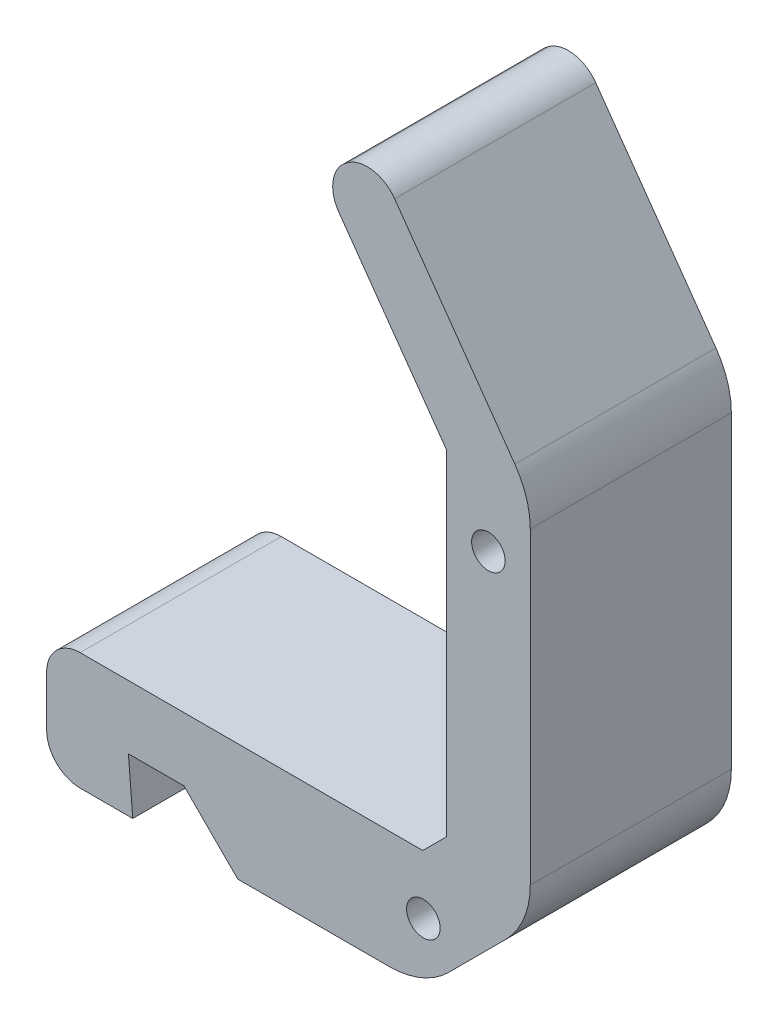
ISO-10303-21;
HEADER;
FILE_DESCRIPTION(('STEP AP214'),'2;1');
FILE_NAME('part.step','',(''),(''),'','','');
FILE_SCHEMA(('AUTOMOTIVE_DESIGN { 1 0 10303 214 1 1 1 1 }'));
ENDSEC;
DATA;
#1=APPLICATION_CONTEXT('core data for automotive mechanical design processes');
#2=APPLICATION_PROTOCOL_DEFINITION('international standard','automotive_design',2000,#1);
#3=PRODUCT_CONTEXT('',#1,'mechanical');
#4=PRODUCT('Part','Part','',(#3));
#5=PRODUCT_RELATED_PRODUCT_CATEGORY('part','',(#4));
#6=PRODUCT_DEFINITION_FORMATION('','',#4);
#7=PRODUCT_DEFINITION_CONTEXT('part definition',#1,'design');
#8=PRODUCT_DEFINITION('design','',#6,#7);
#9=PRODUCT_DEFINITION_SHAPE('','',#8);
#10=(LENGTH_UNIT() NAMED_UNIT(*) SI_UNIT(.MILLI.,.METRE.));
#11=(NAMED_UNIT(*) PLANE_ANGLE_UNIT() SI_UNIT($,.RADIAN.));
#12=(NAMED_UNIT(*) SI_UNIT($,.STERADIAN.) SOLID_ANGLE_UNIT());
#13=UNCERTAINTY_MEASURE_WITH_UNIT(LENGTH_MEASURE(1.E-05),#10,'distance_accuracy_value','');
#14=(GEOMETRIC_REPRESENTATION_CONTEXT(3) GLOBAL_UNCERTAINTY_ASSIGNED_CONTEXT((#13)) GLOBAL_UNIT_ASSIGNED_CONTEXT((#10,
#11,#12)) REPRESENTATION_CONTEXT('',''));
#15=CARTESIAN_POINT('',(0.,0.,0.));
#16=DIRECTION('',(0.,0.,1.));
#17=DIRECTION('',(1.,0.,0.));
#18=AXIS2_PLACEMENT_3D('',#15,#16,#17);
#19=CARTESIAN_POINT('',(0.,0.,15.24));
#20=DIRECTION('',(0.,0.,1.));
#21=DIRECTION('',(1.,0.,0.));
#22=AXIS2_PLACEMENT_3D('',#19,#20,#21);
#23=PLANE('',#22);
#24=CARTESIAN_POINT('',(-0.0451280605345879,4.445,15.24));
#25=DIRECTION('',(0.,0.,1.));
#26=DIRECTION('',(1.,0.,0.));
#27=AXIS2_PLACEMENT_3D('',#24,#25,#26);
#28=CIRCLE('',#27,1.27);
#29=CARTESIAN_POINT('',(-1.31512806053459,4.445,15.24));
#30=VERTEX_POINT('',#29);
#31=EDGE_CURVE('E255',#30,#30,#28,.T.);
#32=ORIENTED_EDGE('',*,*,#31,.F.);
#33=EDGE_LOOP('',(#32));
#34=FACE_BOUND('',#33,.T.);
#35=DIRECTION('',(-0.578165069509396,0.815919819834765,0.));
#36=VECTOR('',#35,1.);
#37=CARTESIAN_POINT('',(-3.69251910928628,52.6655419632563,15.24));
#38=LINE('',#37,#36);
#39=CARTESIAN_POINT('',(6.88688595909541,37.7356426445761,15.24));
#40=VERTEX_POINT('',#39);
#41=CARTESIAN_POINT('',(-2.22397983273241,50.593105620876,15.24));
#42=VERTEX_POINT('',#41);
#43=EDGE_CURVE('E463',#40,#42,#38,.T.);
#44=ORIENTED_EDGE('',*,*,#43,.T.);
#45=CARTESIAN_POINT('',(-4.29641617511272,49.1245663443221,15.24));
#46=DIRECTION('',(0.,0.,1.));
#47=DIRECTION('',(1.,0.,0.));
#48=AXIS2_PLACEMENT_3D('',#45,#46,#47);
#49=CIRCLE('',#48,2.54);
#50=CARTESIAN_POINT('',(-5.76495545166658,51.1970026867024,15.24));
#51=VERTEX_POINT('',#50);
#52=EDGE_CURVE('E387',#42,#51,#49,.T.);
#53=ORIENTED_EDGE('',*,*,#52,.T.);
#54=DIRECTION('',(-0.815919819834766,-0.578165069509395,0.));
#55=VECTOR('',#54,1.);
#56=CARTESIAN_POINT('',(-7.91987382702117,49.670016208391,15.24));
#57=LINE('',#56,#55);
#58=CARTESIAN_POINT('',(-5.84743748464086,51.1385554849449,15.24));
#59=VERTEX_POINT('',#58);
#60=EDGE_CURVE('E203',#51,#59,#57,.T.);
#61=ORIENTED_EDGE('',*,*,#60,.T.);
#62=CARTESIAN_POINT('',(-4.378898208087,49.0661191425646,15.24));
#63=DIRECTION('',(0.,0.,1.));
#64=DIRECTION('',(1.,0.,0.));
#65=AXIS2_PLACEMENT_3D('',#62,#63,#64);
#66=CIRCLE('',#65,2.54);
#67=CARTESIAN_POINT('',(-6.4513345504673,47.5975798660107,15.24));
#68=VERTEX_POINT('',#67);
#69=EDGE_CURVE('E198',#59,#68,#66,.T.);
#70=ORIENTED_EDGE('',*,*,#69,.T.);
#71=DIRECTION('',(0.578165069509396,-0.815919819834765,0.));
#72=VECTOR('',#71,1.);
#73=CARTESIAN_POINT('',(1.70579510314465,36.0860512242138,15.24));
#74=LINE('',#73,#72);
#75=CARTESIAN_POINT('',(1.70579510314465,36.0860512242138,15.24));
#76=VERTEX_POINT('',#75);
#77=EDGE_CURVE('E189',#68,#76,#74,.T.);
#78=ORIENTED_EDGE('',*,*,#77,.T.);
#79=DIRECTION('',(0.,-1.,0.));
#80=VECTOR('',#79,1.);
#81=CARTESIAN_POINT('',(1.70579510314465,36.0860512242138,15.24));
#82=LINE('',#81,#80);
#83=CARTESIAN_POINT('',(1.70579510314466,10.6860512242138,15.24));
#84=VERTEX_POINT('',#83);
#85=EDGE_CURVE('E194',#76,#84,#82,.T.);
#86=ORIENTED_EDGE('',*,*,#85,.T.);
#87=DIRECTION('',(-0.707106781186547,-0.707106781186548,0.));
#88=VECTOR('',#87,1.);
#89=CARTESIAN_POINT('',(1.70579510314466,10.6860512242138,15.24));
#90=LINE('',#89,#88);
#91=CARTESIAN_POINT('',(-0.0902561210691757,8.89,15.24));
#92=VERTEX_POINT('',#91);
#93=EDGE_CURVE('E220',#84,#92,#90,.T.);
#94=ORIENTED_EDGE('',*,*,#93,.T.);
#95=DIRECTION('',(-1.,0.,0.));
#96=VECTOR('',#95,1.);
#97=CARTESIAN_POINT('',(-0.0902561210691757,8.89,15.24));
#98=LINE('',#97,#96);
#99=CARTESIAN_POINT('',(-26.0556304028333,8.89,15.24));
#100=VERTEX_POINT('',#99);
#101=EDGE_CURVE('E223',#92,#100,#98,.T.);
#102=ORIENTED_EDGE('',*,*,#101,.T.);
#103=CARTESIAN_POINT('',(-26.0556304028333,6.35,15.24));
#104=DIRECTION('',(0.,0.,1.));
#105=DIRECTION('',(1.,0.,0.));
#106=AXIS2_PLACEMENT_3D('',#103,#104,#105);
#107=CIRCLE('',#106,2.54);
#108=CARTESIAN_POINT('',(-28.5956304028333,6.35,15.24));
#109=VERTEX_POINT('',#108);
#110=EDGE_CURVE('E382',#100,#109,#107,.T.);
#111=ORIENTED_EDGE('',*,*,#110,.T.);
#112=DIRECTION('',(0.,-1.,0.));
#113=VECTOR('',#112,1.);
#114=CARTESIAN_POINT('',(-28.5956304028333,0.,15.24));
#115=LINE('',#114,#113);
#116=CARTESIAN_POINT('',(-28.5956304028333,2.54,15.24));
#117=VERTEX_POINT('',#116);
#118=EDGE_CURVE('E230',#109,#117,#115,.T.);
#119=ORIENTED_EDGE('',*,*,#118,.T.);
#120=CARTESIAN_POINT('',(-26.0556304028333,2.54,15.24));
#121=DIRECTION('',(0.,0.,1.));
#122=DIRECTION('',(1.,0.,0.));
#123=AXIS2_PLACEMENT_3D('',#120,#121,#122);
#124=CIRCLE('',#123,2.54);
#125=CARTESIAN_POINT('',(-26.0556304028333,0.,15.24));
#126=VERTEX_POINT('',#125);
#127=EDGE_CURVE('E61',#117,#126,#124,.T.);
#128=ORIENTED_EDGE('',*,*,#127,.T.);
#129=DIRECTION('',(1.,0.,0.));
#130=VECTOR('',#129,1.);
#131=CARTESIAN_POINT('',(-22.0682023149362,0.,15.24));
#132=LINE('',#131,#130);
#133=CARTESIAN_POINT('',(-22.0682023149362,0.,15.24));
#134=VERTEX_POINT('',#133);
#135=EDGE_CURVE('E233',#126,#134,#132,.T.);
#136=ORIENTED_EDGE('',*,*,#135,.T.);
#137=DIRECTION('',(-0.0807809246104137,0.996731880808017,0.));
#138=VECTOR('',#137,1.);
#139=CARTESIAN_POINT('',(-22.3990657727126,4.08242611916741,15.24));
#140=LINE('',#139,#138);
#141=CARTESIAN_POINT('',(-22.3990657727126,4.08242611916741,15.24));
#142=VERTEX_POINT('',#141);
#143=EDGE_CURVE('E236',#134,#142,#140,.T.);
#144=ORIENTED_EDGE('',*,*,#143,.T.);
#145=DIRECTION('',(1.,0.,0.));
#146=VECTOR('',#145,1.);
#147=CARTESIAN_POINT('',(-18.1907700285421,4.08242611916741,15.24));
#148=LINE('',#147,#146);
#149=CARTESIAN_POINT('',(-18.1907700285421,4.08242611916741,15.24));
#150=VERTEX_POINT('',#149);
#151=EDGE_CURVE('E239',#142,#150,#148,.T.);
#152=ORIENTED_EDGE('',*,*,#151,.T.);
#153=DIRECTION('',(0.707106781186546,-0.707106781186549,0.));
#154=VECTOR('',#153,1.);
#155=CARTESIAN_POINT('',(-14.1083439093747,0.,15.24));
#156=LINE('',#155,#154);
#157=CARTESIAN_POINT('',(-14.1083439093747,0.,15.24));
#158=VERTEX_POINT('',#157);
#159=EDGE_CURVE('E242',#150,#158,#156,.T.);
#160=ORIENTED_EDGE('',*,*,#159,.T.);
#161=DIRECTION('',(1.,0.,0.));
#162=VECTOR('',#161,1.);
#163=CARTESIAN_POINT('',(0.,0.,15.24));
#164=LINE('',#163,#162);
#165=CARTESIAN_POINT('',(-2.63025612106916,0.,15.24));
#166=VERTEX_POINT('',#165);
#167=EDGE_CURVE('E245',#158,#166,#164,.T.);
#168=ORIENTED_EDGE('',*,*,#167,.T.);
#169=CARTESIAN_POINT('',(-2.63025612106916,6.35,15.24));
#170=DIRECTION('',(0.,0.,1.));
#171=DIRECTION('',(1.,0.,0.));
#172=AXIS2_PLACEMENT_3D('',#169,#170,#171);
#173=CIRCLE('',#172,6.35);
#174=CARTESIAN_POINT('',(1.85987193946542,1.85987193946543,15.24));
#175=VERTEX_POINT('',#174);
#176=EDGE_CURVE('E339',#166,#175,#173,.T.);
#177=ORIENTED_EDGE('',*,*,#176,.T.);
#178=DIRECTION('',(0.707106781186546,0.707106781186549,0.));
#179=VECTOR('',#178,1.);
#180=CARTESIAN_POINT('',(0.,0.,15.24));
#181=LINE('',#180,#179);
#182=CARTESIAN_POINT('',(6.19592316367923,6.19592316367925,15.24));
#183=VERTEX_POINT('',#182);
#184=EDGE_CURVE('E298',#175,#183,#181,.T.);
#185=ORIENTED_EDGE('',*,*,#184,.T.);
#186=CARTESIAN_POINT('',(1.70579510314465,10.6860512242138,15.24));
#187=DIRECTION('',(0.,0.,1.));
#188=DIRECTION('',(1.,0.,0.));
#189=AXIS2_PLACEMENT_3D('',#186,#187,#188);
#190=CIRCLE('',#189,6.35);
#191=CARTESIAN_POINT('',(8.05579510314465,10.6860512242138,15.24));
#192=VERTEX_POINT('',#191);
#193=EDGE_CURVE('E342',#183,#192,#190,.T.);
#194=ORIENTED_EDGE('',*,*,#193,.T.);
#195=DIRECTION('',(0.,1.,0.));
#196=VECTOR('',#195,1.);
#197=CARTESIAN_POINT('',(8.05579510314465,8.05579510314468,15.24));
#198=LINE('',#197,#196);
#199=CARTESIAN_POINT('',(8.05579510314465,34.0642944531915,15.24));
#200=VERTEX_POINT('',#199);
#201=EDGE_CURVE('E460',#192,#200,#198,.T.);
#202=ORIENTED_EDGE('',*,*,#201,.T.);
#203=CARTESIAN_POINT('',(1.70579510314465,34.0642944531915,15.24));
#204=DIRECTION('',(0.,0.,1.));
#205=DIRECTION('',(1.,0.,0.));
#206=AXIS2_PLACEMENT_3D('',#203,#204,#205);
#207=CIRCLE('',#206,6.35);
#208=EDGE_CURVE('E345',#200,#40,#207,.T.);
#209=ORIENTED_EDGE('',*,*,#208,.T.);
#210=EDGE_LOOP('',(#44,#53,#61,#70,#78,#86,#94,#102,#111,#119,#128,#136,#144,#152,#160,#168,
#177,#185,#194,#202,#209));
#211=FACE_BOUND('',#210,.T.);
#212=CARTESIAN_POINT('',(4.88079510314465,31.0060512242138,15.24));
#213=DIRECTION('',(0.,0.,1.));
#214=DIRECTION('',(1.,0.,0.));
#215=AXIS2_PLACEMENT_3D('',#212,#213,#214);
#216=CIRCLE('',#215,1.27);
#217=CARTESIAN_POINT('',(3.61079510314465,31.0060512242138,15.24));
#218=VERTEX_POINT('',#217);
#219=EDGE_CURVE('E703',#218,#218,#216,.T.);
#220=ORIENTED_EDGE('',*,*,#219,.F.);
#221=EDGE_LOOP('',(#220));
#222=FACE_BOUND('',#221,.T.);
#223=ADVANCED_FACE('F45',(#34,#211,#222),#23,.T.);
#224=CARTESIAN_POINT('',(0.,0.,0.));
#225=DIRECTION('',(0.,0.,1.));
#226=DIRECTION('',(1.,0.,0.));
#227=AXIS2_PLACEMENT_3D('',#224,#225,#226);
#228=PLANE('',#227);
#229=DIRECTION('',(-0.815919819834766,-0.578165069509395,0.));
#230=VECTOR('',#229,1.);
#231=CARTESIAN_POINT('',(-7.91987382702117,49.670016208391,0.));
#232=LINE('',#231,#230);
#233=CARTESIAN_POINT('',(-5.76495545166658,51.1970026867024,0.));
#234=VERTEX_POINT('',#233);
#235=CARTESIAN_POINT('',(-5.84743748464086,51.1385554849449,0.));
#236=VERTEX_POINT('',#235);
#237=EDGE_CURVE('E263',#234,#236,#232,.T.);
#238=ORIENTED_EDGE('',*,*,#237,.F.);
#239=CARTESIAN_POINT('',(-4.29641617511272,49.1245663443221,0.));
#240=DIRECTION('',(0.,0.,1.));
#241=DIRECTION('',(1.,0.,0.));
#242=AXIS2_PLACEMENT_3D('',#239,#240,#241);
#243=CIRCLE('',#242,2.54);
#244=CARTESIAN_POINT('',(-2.22397983273241,50.593105620876,0.));
#245=VERTEX_POINT('',#244);
#246=EDGE_CURVE('E374',#234,#245,#243,.F.);
#247=ORIENTED_EDGE('',*,*,#246,.T.);
#248=DIRECTION('',(-0.578165069509396,0.815919819834765,0.));
#249=VECTOR('',#248,1.);
#250=CARTESIAN_POINT('',(-3.69251910928628,52.6655419632563,0.));
#251=LINE('',#250,#249);
#252=CARTESIAN_POINT('',(6.88688595909541,37.7356426445761,0.));
#253=VERTEX_POINT('',#252);
#254=EDGE_CURVE('E259',#253,#245,#251,.T.);
#255=ORIENTED_EDGE('',*,*,#254,.F.);
#256=CARTESIAN_POINT('',(1.70579510314465,34.0642944531915,0.));
#257=DIRECTION('',(0.,0.,1.));
#258=DIRECTION('',(1.,0.,0.));
#259=AXIS2_PLACEMENT_3D('',#256,#257,#258);
#260=CIRCLE('',#259,6.35);
#261=CARTESIAN_POINT('',(8.05579510314465,34.0642944531915,0.));
#262=VERTEX_POINT('',#261);
#263=EDGE_CURVE('E329',#253,#262,#260,.F.);
#264=ORIENTED_EDGE('',*,*,#263,.T.);
#265=DIRECTION('',(0.,1.,0.));
#266=VECTOR('',#265,1.);
#267=CARTESIAN_POINT('',(8.05579510314465,8.05579510314468,0.));
#268=LINE('',#267,#266);
#269=CARTESIAN_POINT('',(8.05579510314465,10.6860512242138,0.));
#270=VERTEX_POINT('',#269);
#271=EDGE_CURVE('E254',#270,#262,#268,.T.);
#272=ORIENTED_EDGE('',*,*,#271,.F.);
#273=CARTESIAN_POINT('',(1.70579510314465,10.6860512242138,0.));
#274=DIRECTION('',(0.,0.,1.));
#275=DIRECTION('',(1.,0.,0.));
#276=AXIS2_PLACEMENT_3D('',#273,#274,#275);
#277=CIRCLE('',#276,6.35);
#278=CARTESIAN_POINT('',(6.19592316367923,6.19592316367925,0.));
#279=VERTEX_POINT('',#278);
#280=EDGE_CURVE('E326',#270,#279,#277,.F.);
#281=ORIENTED_EDGE('',*,*,#280,.T.);
#282=DIRECTION('',(0.707106781186546,0.707106781186549,0.));
#283=VECTOR('',#282,1.);
#284=CARTESIAN_POINT('',(0.,0.,0.));
#285=LINE('',#284,#283);
#286=CARTESIAN_POINT('',(1.85987193946542,1.85987193946543,0.));
#287=VERTEX_POINT('',#286);
#288=EDGE_CURVE('E250',#287,#279,#285,.T.);
#289=ORIENTED_EDGE('',*,*,#288,.F.);
#290=CARTESIAN_POINT('',(-2.63025612106916,6.35,0.));
#291=DIRECTION('',(0.,0.,1.));
#292=DIRECTION('',(1.,0.,0.));
#293=AXIS2_PLACEMENT_3D('',#290,#291,#292);
#294=CIRCLE('',#293,6.35);
#295=CARTESIAN_POINT('',(-2.63025612106916,0.,0.));
#296=VERTEX_POINT('',#295);
#297=EDGE_CURVE('E323',#287,#296,#294,.F.);
#298=ORIENTED_EDGE('',*,*,#297,.T.);
#299=DIRECTION('',(1.,0.,0.));
#300=VECTOR('',#299,1.);
#301=CARTESIAN_POINT('',(0.,0.,0.));
#302=LINE('',#301,#300);
#303=CARTESIAN_POINT('',(-14.1083439093747,0.,0.));
#304=VERTEX_POINT('',#303);
#305=EDGE_CURVE('E294',#304,#296,#302,.T.);
#306=ORIENTED_EDGE('',*,*,#305,.F.);
#307=DIRECTION('',(0.707106781186546,-0.707106781186549,0.));
#308=VECTOR('',#307,1.);
#309=CARTESIAN_POINT('',(-14.1083439093747,0.,0.));
#310=LINE('',#309,#308);
#311=CARTESIAN_POINT('',(-18.1907700285421,4.08242611916741,0.));
#312=VERTEX_POINT('',#311);
#313=EDGE_CURVE('E291',#312,#304,#310,.T.);
#314=ORIENTED_EDGE('',*,*,#313,.F.);
#315=DIRECTION('',(1.,0.,0.));
#316=VECTOR('',#315,1.);
#317=CARTESIAN_POINT('',(-18.1907700285421,4.08242611916741,0.));
#318=LINE('',#317,#316);
#319=CARTESIAN_POINT('',(-22.3990657727126,4.08242611916741,0.));
#320=VERTEX_POINT('',#319);
#321=EDGE_CURVE('E288',#320,#312,#318,.T.);
#322=ORIENTED_EDGE('',*,*,#321,.F.);
#323=DIRECTION('',(-0.0807809246104137,0.996731880808017,0.));
#324=VECTOR('',#323,1.);
#325=CARTESIAN_POINT('',(-22.3990657727126,4.08242611916741,0.));
#326=LINE('',#325,#324);
#327=CARTESIAN_POINT('',(-22.0682023149362,0.,0.));
#328=VERTEX_POINT('',#327);
#329=EDGE_CURVE('E285',#328,#320,#326,.T.);
#330=ORIENTED_EDGE('',*,*,#329,.F.);
#331=DIRECTION('',(1.,0.,0.));
#332=VECTOR('',#331,1.);
#333=CARTESIAN_POINT('',(-22.0682023149362,0.,0.));
#334=LINE('',#333,#332);
#335=CARTESIAN_POINT('',(-26.0556304028333,0.,0.));
#336=VERTEX_POINT('',#335);
#337=EDGE_CURVE('E282',#336,#328,#334,.T.);
#338=ORIENTED_EDGE('',*,*,#337,.F.);
#339=CARTESIAN_POINT('',(-26.0556304028333,2.54,0.));
#340=DIRECTION('',(0.,0.,1.));
#341=DIRECTION('',(1.,0.,0.));
#342=AXIS2_PLACEMENT_3D('',#339,#340,#341);
#343=CIRCLE('',#342,2.54);
#344=CARTESIAN_POINT('',(-28.5956304028333,2.54,0.));
#345=VERTEX_POINT('',#344);
#346=EDGE_CURVE('E365',#336,#345,#343,.F.);
#347=ORIENTED_EDGE('',*,*,#346,.T.);
#348=DIRECTION('',(0.,-1.,0.));
#349=VECTOR('',#348,1.);
#350=CARTESIAN_POINT('',(-28.5956304028333,0.,0.));
#351=LINE('',#350,#349);
#352=CARTESIAN_POINT('',(-28.5956304028333,6.35,0.));
#353=VERTEX_POINT('',#352);
#354=EDGE_CURVE('E279',#353,#345,#351,.T.);
#355=ORIENTED_EDGE('',*,*,#354,.F.);
#356=CARTESIAN_POINT('',(-26.0556304028333,6.35,0.));
#357=DIRECTION('',(0.,0.,1.));
#358=DIRECTION('',(1.,0.,0.));
#359=AXIS2_PLACEMENT_3D('',#356,#357,#358);
#360=CIRCLE('',#359,2.54);
#361=CARTESIAN_POINT('',(-26.0556304028333,8.89,0.));
#362=VERTEX_POINT('',#361);
#363=EDGE_CURVE('E368',#353,#362,#360,.F.);
#364=ORIENTED_EDGE('',*,*,#363,.T.);
#365=DIRECTION('',(-1.,0.,0.));
#366=VECTOR('',#365,1.);
#367=CARTESIAN_POINT('',(-0.0902561210691757,8.89,0.));
#368=LINE('',#367,#366);
#369=CARTESIAN_POINT('',(-0.0902561210691757,8.89,0.));
#370=VERTEX_POINT('',#369);
#371=EDGE_CURVE('E275',#370,#362,#368,.T.);
#372=ORIENTED_EDGE('',*,*,#371,.F.);
#373=DIRECTION('',(-0.707106781186547,-0.707106781186548,0.));
#374=VECTOR('',#373,1.);
#375=CARTESIAN_POINT('',(1.70579510314466,10.6860512242138,0.));
#376=LINE('',#375,#374);
#377=CARTESIAN_POINT('',(1.70579510314466,10.6860512242138,0.));
#378=VERTEX_POINT('',#377);
#379=EDGE_CURVE('E272',#378,#370,#376,.T.);
#380=ORIENTED_EDGE('',*,*,#379,.F.);
#381=DIRECTION('',(0.,-1.,0.));
#382=VECTOR('',#381,1.);
#383=CARTESIAN_POINT('',(1.70579510314465,36.0860512242138,0.));
#384=LINE('',#383,#382);
#385=CARTESIAN_POINT('',(1.70579510314465,36.0860512242138,0.));
#386=VERTEX_POINT('',#385);
#387=EDGE_CURVE('E269',#386,#378,#384,.T.);
#388=ORIENTED_EDGE('',*,*,#387,.F.);
#389=DIRECTION('',(0.578165069509396,-0.815919819834765,0.));
#390=VECTOR('',#389,1.);
#391=CARTESIAN_POINT('',(1.70579510314465,36.0860512242138,0.));
#392=LINE('',#391,#390);
#393=CARTESIAN_POINT('',(-6.4513345504673,47.5975798660107,0.));
#394=VERTEX_POINT('',#393);
#395=EDGE_CURVE('E209',#394,#386,#392,.T.);
#396=ORIENTED_EDGE('',*,*,#395,.F.);
#397=CARTESIAN_POINT('',(-4.378898208087,49.0661191425646,0.));
#398=DIRECTION('',(0.,0.,1.));
#399=DIRECTION('',(1.,0.,0.));
#400=AXIS2_PLACEMENT_3D('',#397,#398,#399);
#401=CIRCLE('',#400,2.54);
#402=EDGE_CURVE('E371',#394,#236,#401,.F.);
#403=ORIENTED_EDGE('',*,*,#402,.T.);
#404=EDGE_LOOP('',(#238,#247,#255,#264,#272,#281,#289,#298,#306,#314,#322,#330,#338,#347,#355,
#364,#372,#380,#388,#396,#403));
#405=FACE_BOUND('',#404,.T.);
#406=CARTESIAN_POINT('',(-0.0451280605345879,4.445,0.));
#407=DIRECTION('',(0.,0.,1.));
#408=DIRECTION('',(1.,0.,0.));
#409=AXIS2_PLACEMENT_3D('',#406,#407,#408);
#410=CIRCLE('',#409,1.27);
#411=CARTESIAN_POINT('',(-1.31512806053459,4.445,0.));
#412=VERTEX_POINT('',#411);
#413=EDGE_CURVE('E701',#412,#412,#410,.T.);
#414=ORIENTED_EDGE('',*,*,#413,.T.);
#415=EDGE_LOOP('',(#414));
#416=FACE_BOUND('',#415,.T.);
#417=CARTESIAN_POINT('',(4.88079510314465,31.0060512242138,0.));
#418=DIRECTION('',(0.,0.,1.));
#419=DIRECTION('',(1.,0.,0.));
#420=AXIS2_PLACEMENT_3D('',#417,#418,#419);
#421=CIRCLE('',#420,1.27);
#422=CARTESIAN_POINT('',(3.61079510314465,31.0060512242138,0.));
#423=VERTEX_POINT('',#422);
#424=EDGE_CURVE('E708',#423,#423,#421,.T.);
#425=ORIENTED_EDGE('',*,*,#424,.T.);
#426=EDGE_LOOP('',(#425));
#427=FACE_BOUND('',#426,.T.);
#428=ADVANCED_FACE('F413',(#405,#416,#427),#228,.F.);
#429=CARTESIAN_POINT('',(0.,0.,15.24));
#430=DIRECTION('',(-0.707106781186549,0.707106781186546,0.));
#431=DIRECTION('',(-0.707106781186546,-0.707106781186549,0.));
#432=AXIS2_PLACEMENT_3D('',#429,#430,#431);
#433=PLANE('',#432);
#434=ORIENTED_EDGE('',*,*,#288,.T.);
#435=DIRECTION('',(0.,0.,-1.));
#436=VECTOR('',#435,1.);
#437=CARTESIAN_POINT('',(6.19592316367923,6.19592316367925,15.24));
#438=LINE('',#437,#436);
#439=EDGE_CURVE('E352',#279,#183,#438,.F.);
#440=ORIENTED_EDGE('',*,*,#439,.T.);
#441=ORIENTED_EDGE('',*,*,#184,.F.);
#442=DIRECTION('',(0.,0.,-1.));
#443=VECTOR('',#442,1.);
#444=CARTESIAN_POINT('',(1.85987193946542,1.85987193946543,15.24));
#445=LINE('',#444,#443);
#446=EDGE_CURVE('E348',#175,#287,#445,.T.);
#447=ORIENTED_EDGE('',*,*,#446,.T.);
#448=EDGE_LOOP('',(#434,#440,#441,#447));
#449=FACE_BOUND('',#448,.T.);
#450=ADVANCED_FACE('F447',(#449),#433,.F.);
#451=CARTESIAN_POINT('',(8.05579510314465,8.05579510314468,15.24));
#452=DIRECTION('',(-1.,0.,0.));
#453=DIRECTION('',(0.,0.,1.));
#454=AXIS2_PLACEMENT_3D('',#451,#452,#453);
#455=PLANE('',#454);
#456=ORIENTED_EDGE('',*,*,#271,.T.);
#457=DIRECTION('',(0.,0.,-1.));
#458=VECTOR('',#457,1.);
#459=CARTESIAN_POINT('',(8.05579510314465,34.0642944531915,15.24));
#460=LINE('',#459,#458);
#461=EDGE_CURVE('E336',#262,#200,#460,.F.);
#462=ORIENTED_EDGE('',*,*,#461,.T.);
#463=ORIENTED_EDGE('',*,*,#201,.F.);
#464=DIRECTION('',(0.,0.,-1.));
#465=VECTOR('',#464,1.);
#466=CARTESIAN_POINT('',(8.05579510314465,10.6860512242138,15.24));
#467=LINE('',#466,#465);
#468=EDGE_CURVE('E332',#192,#270,#467,.T.);
#469=ORIENTED_EDGE('',*,*,#468,.T.);
#470=EDGE_LOOP('',(#456,#462,#463,#469));
#471=FACE_BOUND('',#470,.T.);
#472=ADVANCED_FACE('F457',(#471),#455,.F.);
#473=CARTESIAN_POINT('',(-3.69251910928628,52.6655419632563,15.24));
#474=DIRECTION('',(-0.815919819834765,-0.578165069509396,0.));
#475=DIRECTION('',(0.578165069509396,-0.815919819834765,0.));
#476=AXIS2_PLACEMENT_3D('',#473,#474,#475);
#477=PLANE('',#476);
#478=ORIENTED_EDGE('',*,*,#254,.T.);
#479=DIRECTION('',(0.,0.,-1.));
#480=VECTOR('',#479,1.);
#481=CARTESIAN_POINT('',(-2.22397983273241,50.593105620876,15.24));
#482=LINE('',#481,#480);
#483=EDGE_CURVE('E377',#245,#42,#482,.F.);
#484=ORIENTED_EDGE('',*,*,#483,.T.);
#485=ORIENTED_EDGE('',*,*,#43,.F.);
#486=DIRECTION('',(0.,0.,-1.));
#487=VECTOR('',#486,1.);
#488=CARTESIAN_POINT('',(6.88688595909541,37.7356426445761,15.24));
#489=LINE('',#488,#487);
#490=EDGE_CURVE('E213',#40,#253,#489,.T.);
#491=ORIENTED_EDGE('',*,*,#490,.T.);
#492=EDGE_LOOP('',(#478,#484,#485,#491));
#493=FACE_BOUND('',#492,.T.);
#494=ADVANCED_FACE('F643',(#493),#477,.F.);
#495=CARTESIAN_POINT('',(-7.91987382702117,49.670016208391,15.24));
#496=DIRECTION('',(0.578165069509395,-0.815919819834766,0.));
#497=DIRECTION('',(0.815919819834766,0.578165069509395,0.));
#498=AXIS2_PLACEMENT_3D('',#495,#496,#497);
#499=PLANE('',#498);
#500=ORIENTED_EDGE('',*,*,#60,.F.);
#501=DIRECTION('',(0.,0.,-1.));
#502=VECTOR('',#501,1.);
#503=CARTESIAN_POINT('',(-5.76495545166658,51.1970026867024,15.24));
#504=LINE('',#503,#502);
#505=EDGE_CURVE('E361',#51,#234,#504,.T.);
#506=ORIENTED_EDGE('',*,*,#505,.T.);
#507=ORIENTED_EDGE('',*,*,#237,.T.);
#508=DIRECTION('',(0.,0.,-1.));
#509=VECTOR('',#508,1.);
#510=CARTESIAN_POINT('',(-5.84743748464086,51.1385554849449,15.24));
#511=LINE('',#510,#509);
#512=EDGE_CURVE('E358',#236,#59,#511,.F.);
#513=ORIENTED_EDGE('',*,*,#512,.T.);
#514=EDGE_LOOP('',(#500,#506,#507,#513));
#515=FACE_BOUND('',#514,.T.);
#516=ADVANCED_FACE('F635',(#515),#499,.F.);
#517=CARTESIAN_POINT('',(1.70579510314465,36.0860512242138,15.24));
#518=DIRECTION('',(0.815919819834765,0.578165069509396,0.));
#519=DIRECTION('',(-0.578165069509396,0.815919819834765,0.));
#520=AXIS2_PLACEMENT_3D('',#517,#518,#519);
#521=PLANE('',#520);
#522=ORIENTED_EDGE('',*,*,#77,.F.);
#523=DIRECTION('',(0.,0.,-1.));
#524=VECTOR('',#523,1.);
#525=CARTESIAN_POINT('',(-6.4513345504673,47.5975798660107,15.24));
#526=LINE('',#525,#524);
#527=EDGE_CURVE('E390',#68,#394,#526,.T.);
#528=ORIENTED_EDGE('',*,*,#527,.T.);
#529=ORIENTED_EDGE('',*,*,#395,.T.);
#530=DIRECTION('',(0.,0.,-1.));
#531=VECTOR('',#530,1.);
#532=CARTESIAN_POINT('',(1.70579510314465,36.0860512242138,15.24));
#533=LINE('',#532,#531);
#534=EDGE_CURVE('E206',#76,#386,#533,.T.);
#535=ORIENTED_EDGE('',*,*,#534,.F.);
#536=EDGE_LOOP('',(#522,#528,#529,#535));
#537=FACE_BOUND('',#536,.T.);
#538=ADVANCED_FACE('F207',(#537),#521,.F.);
#539=CARTESIAN_POINT('',(1.70579510314465,36.0860512242138,15.24));
#540=DIRECTION('',(1.,0.,0.));
#541=DIRECTION('',(0.,1.,0.));
#542=AXIS2_PLACEMENT_3D('',#539,#540,#541);
#543=PLANE('',#542);
#544=ORIENTED_EDGE('',*,*,#387,.T.);
#545=DIRECTION('',(0.,0.,-1.));
#546=VECTOR('',#545,1.);
#547=CARTESIAN_POINT('',(1.70579510314466,10.6860512242138,15.24));
#548=LINE('',#547,#546);
#549=EDGE_CURVE('E214',#84,#378,#548,.T.);
#550=ORIENTED_EDGE('',*,*,#549,.F.);
#551=ORIENTED_EDGE('',*,*,#85,.F.);
#552=ORIENTED_EDGE('',*,*,#534,.T.);
#553=EDGE_LOOP('',(#544,#550,#551,#552));
#554=FACE_BOUND('',#553,.T.);
#555=ADVANCED_FACE('F216',(#554),#543,.F.);
#556=CARTESIAN_POINT('',(1.70579510314466,10.6860512242138,15.24));
#557=DIRECTION('',(0.707106781186548,-0.707106781186547,0.));
#558=DIRECTION('',(0.707106781186547,0.707106781186548,0.));
#559=AXIS2_PLACEMENT_3D('',#556,#557,#558);
#560=PLANE('',#559);
#561=ORIENTED_EDGE('',*,*,#379,.T.);
#562=DIRECTION('',(0.,0.,-1.));
#563=VECTOR('',#562,1.);
#564=CARTESIAN_POINT('',(-0.0902561210691757,8.89,15.24));
#565=LINE('',#564,#563);
#566=EDGE_CURVE('E314',#92,#370,#565,.T.);
#567=ORIENTED_EDGE('',*,*,#566,.F.);
#568=ORIENTED_EDGE('',*,*,#93,.F.);
#569=ORIENTED_EDGE('',*,*,#549,.T.);
#570=EDGE_LOOP('',(#561,#567,#568,#569));
#571=FACE_BOUND('',#570,.T.);
#572=ADVANCED_FACE('F480',(#571),#560,.F.);
#573=CARTESIAN_POINT('',(-0.0902561210691757,8.89,15.24));
#574=DIRECTION('',(0.,-1.,0.));
#575=DIRECTION('',(0.,0.,-1.));
#576=AXIS2_PLACEMENT_3D('',#573,#574,#575);
#577=PLANE('',#576);
#578=ORIENTED_EDGE('',*,*,#371,.T.);
#579=DIRECTION('',(0.,0.,-1.));
#580=VECTOR('',#579,1.);
#581=CARTESIAN_POINT('',(-26.0556304028333,8.89,15.24));
#582=LINE('',#581,#580);
#583=EDGE_CURVE('E54',#362,#100,#582,.F.);
#584=ORIENTED_EDGE('',*,*,#583,.T.);
#585=ORIENTED_EDGE('',*,*,#101,.F.);
#586=ORIENTED_EDGE('',*,*,#566,.T.);
#587=EDGE_LOOP('',(#578,#584,#585,#586));
#588=FACE_BOUND('',#587,.T.);
#589=ADVANCED_FACE('F402',(#588),#577,.F.);
#590=CARTESIAN_POINT('',(-28.5956304028333,0.,15.24));
#591=DIRECTION('',(1.,0.,0.));
#592=DIRECTION('',(0.,0.,-1.));
#593=AXIS2_PLACEMENT_3D('',#590,#591,#592);
#594=PLANE('',#593);
#595=ORIENTED_EDGE('',*,*,#118,.F.);
#596=DIRECTION('',(0.,0.,-1.));
#597=VECTOR('',#596,1.);
#598=CARTESIAN_POINT('',(-28.5956304028333,6.35,15.24));
#599=LINE('',#598,#597);
#600=EDGE_CURVE('E395',#109,#353,#599,.T.);
#601=ORIENTED_EDGE('',*,*,#600,.T.);
#602=ORIENTED_EDGE('',*,*,#354,.T.);
#603=DIRECTION('',(0.,0.,-1.));
#604=VECTOR('',#603,1.);
#605=CARTESIAN_POINT('',(-28.5956304028333,2.54,15.24));
#606=LINE('',#605,#604);
#607=EDGE_CURVE('E69',#345,#117,#606,.F.);
#608=ORIENTED_EDGE('',*,*,#607,.T.);
#609=EDGE_LOOP('',(#595,#601,#602,#608));
#610=FACE_BOUND('',#609,.T.);
#611=ADVANCED_FACE('F410',(#610),#594,.F.);
#612=CARTESIAN_POINT('',(-22.0682023149362,0.,15.24));
#613=DIRECTION('',(0.,1.,0.));
#614=DIRECTION('',(0.,0.,1.));
#615=AXIS2_PLACEMENT_3D('',#612,#613,#614);
#616=PLANE('',#615);
#617=ORIENTED_EDGE('',*,*,#135,.F.);
#618=DIRECTION('',(0.,0.,-1.));
#619=VECTOR('',#618,1.);
#620=CARTESIAN_POINT('',(-26.0556304028333,0.,15.24));
#621=LINE('',#620,#619);
#622=EDGE_CURVE('E11',#126,#336,#621,.T.);
#623=ORIENTED_EDGE('',*,*,#622,.T.);
#624=ORIENTED_EDGE('',*,*,#337,.T.);
#625=DIRECTION('',(0.,0.,-1.));
#626=VECTOR('',#625,1.);
#627=CARTESIAN_POINT('',(-22.0682023149362,0.,15.24));
#628=LINE('',#627,#626);
#629=EDGE_CURVE('E310',#134,#328,#628,.T.);
#630=ORIENTED_EDGE('',*,*,#629,.F.);
#631=EDGE_LOOP('',(#617,#623,#624,#630));
#632=FACE_BOUND('',#631,.T.);
#633=ADVANCED_FACE('F420',(#632),#616,.F.);
#634=CARTESIAN_POINT('',(-22.3990657727126,4.08242611916741,15.24));
#635=DIRECTION('',(-0.996731880808017,-0.0807809246104137,0.));
#636=DIRECTION('',(0.0807809246104138,-0.996731880808017,0.));
#637=AXIS2_PLACEMENT_3D('',#634,#635,#636);
#638=PLANE('',#637);
#639=ORIENTED_EDGE('',*,*,#329,.T.);
#640=DIRECTION('',(0.,0.,-1.));
#641=VECTOR('',#640,1.);
#642=CARTESIAN_POINT('',(-22.3990657727126,4.08242611916741,15.24));
#643=LINE('',#642,#641);
#644=EDGE_CURVE('E306',#142,#320,#643,.T.);
#645=ORIENTED_EDGE('',*,*,#644,.F.);
#646=ORIENTED_EDGE('',*,*,#143,.F.);
#647=ORIENTED_EDGE('',*,*,#629,.T.);
#648=EDGE_LOOP('',(#639,#645,#646,#647));
#649=FACE_BOUND('',#648,.T.);
#650=ADVANCED_FACE('F427',(#649),#638,.F.);
#651=CARTESIAN_POINT('',(-18.1907700285421,4.08242611916741,15.24));
#652=DIRECTION('',(0.,1.,0.));
#653=DIRECTION('',(-1.,0.,0.));
#654=AXIS2_PLACEMENT_3D('',#651,#652,#653);
#655=PLANE('',#654);
#656=ORIENTED_EDGE('',*,*,#321,.T.);
#657=DIRECTION('',(0.,0.,-1.));
#658=VECTOR('',#657,1.);
#659=CARTESIAN_POINT('',(-18.1907700285421,4.08242611916741,15.24));
#660=LINE('',#659,#658);
#661=EDGE_CURVE('E302',#150,#312,#660,.T.);
#662=ORIENTED_EDGE('',*,*,#661,.F.);
#663=ORIENTED_EDGE('',*,*,#151,.F.);
#664=ORIENTED_EDGE('',*,*,#644,.T.);
#665=EDGE_LOOP('',(#656,#662,#663,#664));
#666=FACE_BOUND('',#665,.T.);
#667=ADVANCED_FACE('F430',(#666),#655,.F.);
#668=CARTESIAN_POINT('',(-14.1083439093747,0.,15.24));
#669=DIRECTION('',(0.707106781186549,0.707106781186546,0.));
#670=DIRECTION('',(-0.707106781186546,0.707106781186549,0.));
#671=AXIS2_PLACEMENT_3D('',#668,#669,#670);
#672=PLANE('',#671);
#673=ORIENTED_EDGE('',*,*,#313,.T.);
#674=DIRECTION('',(0.,0.,-1.));
#675=VECTOR('',#674,1.);
#676=CARTESIAN_POINT('',(-14.1083439093747,0.,15.24));
#677=LINE('',#676,#675);
#678=EDGE_CURVE('E249',#158,#304,#677,.T.);
#679=ORIENTED_EDGE('',*,*,#678,.F.);
#680=ORIENTED_EDGE('',*,*,#159,.F.);
#681=ORIENTED_EDGE('',*,*,#661,.T.);
#682=EDGE_LOOP('',(#673,#679,#680,#681));
#683=FACE_BOUND('',#682,.T.);
#684=ADVANCED_FACE('F435',(#683),#672,.F.);
#685=CARTESIAN_POINT('',(0.,0.,15.24));
#686=DIRECTION('',(0.,1.,0.));
#687=DIRECTION('',(-1.,0.,0.));
#688=AXIS2_PLACEMENT_3D('',#685,#686,#687);
#689=PLANE('',#688);
#690=ORIENTED_EDGE('',*,*,#305,.T.);
#691=DIRECTION('',(0.,0.,-1.));
#692=VECTOR('',#691,1.);
#693=CARTESIAN_POINT('',(-2.63025612106916,0.,15.24));
#694=LINE('',#693,#692);
#695=EDGE_CURVE('E355',#296,#166,#694,.F.);
#696=ORIENTED_EDGE('',*,*,#695,.T.);
#697=ORIENTED_EDGE('',*,*,#167,.F.);
#698=ORIENTED_EDGE('',*,*,#678,.T.);
#699=EDGE_LOOP('',(#690,#696,#697,#698));
#700=FACE_BOUND('',#699,.T.);
#701=ADVANCED_FACE('F503',(#700),#689,.F.);
#702=CARTESIAN_POINT('',(-0.0451280605345879,4.445,15.24));
#703=DIRECTION('',(0.,0.,-1.));
#704=DIRECTION('',(-1.,0.,0.));
#705=AXIS2_PLACEMENT_3D('',#702,#703,#704);
#706=CYLINDRICAL_SURFACE('',#705,1.27);
#707=CARTESIAN_POINT('',(-1.31512806053459,4.445,15.24));
#708=CARTESIAN_POINT('',(-1.31512806053459,4.445,15.08125));
#709=CARTESIAN_POINT('',(-1.31512806053459,4.445,14.9225));
#710=CARTESIAN_POINT('',(-1.31512806053459,4.445,14.605));
#711=CARTESIAN_POINT('',(-1.31512806053459,4.445,14.44625));
#712=CARTESIAN_POINT('',(-1.31512806053459,4.445,14.12875));
#713=CARTESIAN_POINT('',(-1.31512806053459,4.445,13.97));
#714=CARTESIAN_POINT('',(-1.31512806053459,4.445,13.6525));
#715=CARTESIAN_POINT('',(-1.31512806053459,4.445,13.49375));
#716=CARTESIAN_POINT('',(-1.31512806053459,4.445,13.17625));
#717=CARTESIAN_POINT('',(-1.31512806053459,4.445,13.0175));
#718=CARTESIAN_POINT('',(-1.31512806053459,4.445,12.7));
#719=CARTESIAN_POINT('',(-1.31512806053459,4.445,12.54125));
#720=CARTESIAN_POINT('',(-1.31512806053459,4.445,12.22375));
#721=CARTESIAN_POINT('',(-1.31512806053459,4.445,12.065));
#722=CARTESIAN_POINT('',(-1.31512806053459,4.445,11.7475));
#723=CARTESIAN_POINT('',(-1.31512806053459,4.445,11.58875));
#724=CARTESIAN_POINT('',(-1.31512806053459,4.445,11.27125));
#725=CARTESIAN_POINT('',(-1.31512806053459,4.445,11.1125));
#726=CARTESIAN_POINT('',(-1.31512806053459,4.445,10.795));
#727=CARTESIAN_POINT('',(-1.31512806053459,4.445,10.63625));
#728=CARTESIAN_POINT('',(-1.31512806053459,4.445,10.31875));
#729=CARTESIAN_POINT('',(-1.31512806053459,4.445,10.16));
#730=CARTESIAN_POINT('',(-1.31512806053459,4.445,9.8425));
#731=CARTESIAN_POINT('',(-1.31512806053459,4.445,9.68375));
#732=CARTESIAN_POINT('',(-1.31512806053459,4.445,9.36625));
#733=CARTESIAN_POINT('',(-1.31512806053459,4.445,9.2075));
#734=CARTESIAN_POINT('',(-1.31512806053459,4.445,8.89));
#735=CARTESIAN_POINT('',(-1.31512806053459,4.445,8.73125));
#736=CARTESIAN_POINT('',(-1.31512806053459,4.445,8.41375));
#737=CARTESIAN_POINT('',(-1.31512806053459,4.445,8.255));
#738=CARTESIAN_POINT('',(-1.31512806053459,4.445,7.9375));
#739=CARTESIAN_POINT('',(-1.31512806053459,4.445,7.77875));
#740=CARTESIAN_POINT('',(-1.31512806053459,4.445,7.46125));
#741=CARTESIAN_POINT('',(-1.31512806053459,4.445,7.3025));
#742=CARTESIAN_POINT('',(-1.31512806053459,4.445,6.985));
#743=CARTESIAN_POINT('',(-1.31512806053459,4.445,6.82625));
#744=CARTESIAN_POINT('',(-1.31512806053459,4.445,6.50875));
#745=CARTESIAN_POINT('',(-1.31512806053459,4.445,6.35));
#746=CARTESIAN_POINT('',(-1.31512806053459,4.445,6.0325));
#747=CARTESIAN_POINT('',(-1.31512806053459,4.445,5.87375));
#748=CARTESIAN_POINT('',(-1.31512806053459,4.445,5.55625));
#749=CARTESIAN_POINT('',(-1.31512806053459,4.445,5.3975));
#750=CARTESIAN_POINT('',(-1.31512806053459,4.445,5.08));
#751=CARTESIAN_POINT('',(-1.31512806053459,4.445,4.92125));
#752=CARTESIAN_POINT('',(-1.31512806053459,4.445,4.60375));
#753=CARTESIAN_POINT('',(-1.31512806053459,4.445,4.445));
#754=CARTESIAN_POINT('',(-1.31512806053459,4.445,4.1275));
#755=CARTESIAN_POINT('',(-1.31512806053459,4.445,3.96875));
#756=CARTESIAN_POINT('',(-1.31512806053459,4.445,3.65125));
#757=CARTESIAN_POINT('',(-1.31512806053459,4.445,3.4925));
#758=CARTESIAN_POINT('',(-1.31512806053459,4.445,3.175));
#759=CARTESIAN_POINT('',(-1.31512806053459,4.445,3.01625));
#760=CARTESIAN_POINT('',(-1.31512806053459,4.445,2.69875));
#761=CARTESIAN_POINT('',(-1.31512806053459,4.445,2.54));
#762=CARTESIAN_POINT('',(-1.31512806053459,4.445,2.2225));
#763=CARTESIAN_POINT('',(-1.31512806053459,4.445,2.06375));
#764=CARTESIAN_POINT('',(-1.31512806053459,4.445,1.74625));
#765=CARTESIAN_POINT('',(-1.31512806053459,4.445,1.5875));
#766=CARTESIAN_POINT('',(-1.31512806053459,4.445,1.27));
#767=CARTESIAN_POINT('',(-1.31512806053459,4.445,1.11125));
#768=CARTESIAN_POINT('',(-1.31512806053459,4.445,0.79375));
#769=CARTESIAN_POINT('',(-1.31512806053459,4.445,0.634999999999999));
#770=CARTESIAN_POINT('',(-1.31512806053459,4.445,0.3175));
#771=CARTESIAN_POINT('',(-1.31512806053459,4.445,0.15875));
#772=CARTESIAN_POINT('',(-1.31512806053459,4.445,0.));
#773=B_SPLINE_CURVE_WITH_KNOTS('',3,(#707,#708,#709,#710,#711,#712,#713,#714,#715,#716,#717,
#718,#719,#720,#721,#722,#723,#724,#725,#726,#727,#728,#729,#730,#731,#732,#733,#734,#735,#736,
#737,#738,#739,#740,#741,#742,#743,#744,#745,#746,#747,#748,#749,#750,#751,#752,#753,#754,#755,
#756,#757,#758,#759,#760,#761,#762,#763,#764,#765,#766,#767,#768,#769,#770,#771,#772),
.UNSPECIFIED.,.F.,.F.,(4,2,2,2,2,2,2,2,2,2,2,2,2,2,2,2,2,2,2,2,2,2,2,2,2,2,2,2,2,2,2,2,4),(0.,
0.476249999999999,0.952499999999998,1.42875,1.905,2.38125,2.8575,3.33375,3.81,4.28625,4.7625,
5.23875,5.715,6.19125,6.6675,7.14375,7.62,8.09625,8.5725,9.04875,9.525,10.00125,10.4775,
10.95375,11.43,11.90625,12.3825,12.85875,13.335,13.81125,14.2875,14.76375,15.24),.UNSPECIFIED.);
#774=EDGE_CURVE('BSEAM500',#30,#412,#773,.T.);
#775=ORIENTED_EDGE('',*,*,#31,.T.);
#776=ORIENTED_EDGE('',*,*,#413,.F.);
#777=ORIENTED_EDGE('',*,*,#774,.T.);
#778=ORIENTED_EDGE('',*,*,#774,.F.);
#779=EDGE_LOOP('',(#775,#777,#776,#778));
#780=FACE_BOUND('',#779,.T.);
#781=ADVANCED_FACE('F500',(#780),#706,.F.);
#782=CARTESIAN_POINT('',(4.88079510314465,31.0060512242138,15.24));
#783=DIRECTION('',(0.,0.,-1.));
#784=DIRECTION('',(-1.,0.,0.));
#785=AXIS2_PLACEMENT_3D('',#782,#783,#784);
#786=CYLINDRICAL_SURFACE('',#785,1.27);
#787=CARTESIAN_POINT('',(3.61079510314465,31.0060512242138,15.24));
#788=CARTESIAN_POINT('',(3.61079510314465,31.0060512242138,15.08125));
#789=CARTESIAN_POINT('',(3.61079510314465,31.0060512242138,14.9225));
#790=CARTESIAN_POINT('',(3.61079510314465,31.0060512242138,14.605));
#791=CARTESIAN_POINT('',(3.61079510314465,31.0060512242138,14.44625));
#792=CARTESIAN_POINT('',(3.61079510314465,31.0060512242138,14.12875));
#793=CARTESIAN_POINT('',(3.61079510314465,31.0060512242138,13.97));
#794=CARTESIAN_POINT('',(3.61079510314465,31.0060512242138,13.6525));
#795=CARTESIAN_POINT('',(3.61079510314465,31.0060512242138,13.49375));
#796=CARTESIAN_POINT('',(3.61079510314465,31.0060512242138,13.17625));
#797=CARTESIAN_POINT('',(3.61079510314465,31.0060512242138,13.0175));
#798=CARTESIAN_POINT('',(3.61079510314465,31.0060512242138,12.7));
#799=CARTESIAN_POINT('',(3.61079510314465,31.0060512242138,12.54125));
#800=CARTESIAN_POINT('',(3.61079510314465,31.0060512242138,12.22375));
#801=CARTESIAN_POINT('',(3.61079510314465,31.0060512242138,12.065));
#802=CARTESIAN_POINT('',(3.61079510314465,31.0060512242138,11.7475));
#803=CARTESIAN_POINT('',(3.61079510314465,31.0060512242138,11.58875));
#804=CARTESIAN_POINT('',(3.61079510314465,31.0060512242138,11.27125));
#805=CARTESIAN_POINT('',(3.61079510314465,31.0060512242138,11.1125));
#806=CARTESIAN_POINT('',(3.61079510314465,31.0060512242138,10.795));
#807=CARTESIAN_POINT('',(3.61079510314465,31.0060512242138,10.63625));
#808=CARTESIAN_POINT('',(3.61079510314465,31.0060512242138,10.31875));
#809=CARTESIAN_POINT('',(3.61079510314465,31.0060512242138,10.16));
#810=CARTESIAN_POINT('',(3.61079510314465,31.0060512242138,9.8425));
#811=CARTESIAN_POINT('',(3.61079510314465,31.0060512242138,9.68375));
#812=CARTESIAN_POINT('',(3.61079510314465,31.0060512242138,9.36625));
#813=CARTESIAN_POINT('',(3.61079510314465,31.0060512242138,9.2075));
#814=CARTESIAN_POINT('',(3.61079510314465,31.0060512242138,8.89));
#815=CARTESIAN_POINT('',(3.61079510314465,31.0060512242138,8.73125));
#816=CARTESIAN_POINT('',(3.61079510314465,31.0060512242138,8.41375));
#817=CARTESIAN_POINT('',(3.61079510314465,31.0060512242138,8.255));
#818=CARTESIAN_POINT('',(3.61079510314465,31.0060512242138,7.9375));
#819=CARTESIAN_POINT('',(3.61079510314465,31.0060512242138,7.77875));
#820=CARTESIAN_POINT('',(3.61079510314465,31.0060512242138,7.46125));
#821=CARTESIAN_POINT('',(3.61079510314465,31.0060512242138,7.3025));
#822=CARTESIAN_POINT('',(3.61079510314465,31.0060512242138,6.985));
#823=CARTESIAN_POINT('',(3.61079510314465,31.0060512242138,6.82625));
#824=CARTESIAN_POINT('',(3.61079510314465,31.0060512242138,6.50875));
#825=CARTESIAN_POINT('',(3.61079510314465,31.0060512242138,6.35));
#826=CARTESIAN_POINT('',(3.61079510314465,31.0060512242138,6.0325));
#827=CARTESIAN_POINT('',(3.61079510314465,31.0060512242138,5.87375));
#828=CARTESIAN_POINT('',(3.61079510314465,31.0060512242138,5.55625));
#829=CARTESIAN_POINT('',(3.61079510314465,31.0060512242138,5.3975));
#830=CARTESIAN_POINT('',(3.61079510314465,31.0060512242138,5.08));
#831=CARTESIAN_POINT('',(3.61079510314465,31.0060512242138,4.92125));
#832=CARTESIAN_POINT('',(3.61079510314465,31.0060512242138,4.60375));
#833=CARTESIAN_POINT('',(3.61079510314465,31.0060512242138,4.445));
#834=CARTESIAN_POINT('',(3.61079510314465,31.0060512242138,4.1275));
#835=CARTESIAN_POINT('',(3.61079510314465,31.0060512242138,3.96875));
#836=CARTESIAN_POINT('',(3.61079510314465,31.0060512242138,3.65125));
#837=CARTESIAN_POINT('',(3.61079510314465,31.0060512242138,3.4925));
#838=CARTESIAN_POINT('',(3.61079510314465,31.0060512242138,3.175));
#839=CARTESIAN_POINT('',(3.61079510314465,31.0060512242138,3.01625));
#840=CARTESIAN_POINT('',(3.61079510314465,31.0060512242138,2.69875));
#841=CARTESIAN_POINT('',(3.61079510314465,31.0060512242138,2.54));
#842=CARTESIAN_POINT('',(3.61079510314465,31.0060512242138,2.2225));
#843=CARTESIAN_POINT('',(3.61079510314465,31.0060512242138,2.06375));
#844=CARTESIAN_POINT('',(3.61079510314465,31.0060512242138,1.74625));
#845=CARTESIAN_POINT('',(3.61079510314465,31.0060512242138,1.5875));
#846=CARTESIAN_POINT('',(3.61079510314465,31.0060512242138,1.27));
#847=CARTESIAN_POINT('',(3.61079510314465,31.0060512242138,1.11125));
#848=CARTESIAN_POINT('',(3.61079510314465,31.0060512242138,0.79375));
#849=CARTESIAN_POINT('',(3.61079510314465,31.0060512242138,0.634999999999999));
#850=CARTESIAN_POINT('',(3.61079510314465,31.0060512242138,0.3175));
#851=CARTESIAN_POINT('',(3.61079510314465,31.0060512242138,0.15875));
#852=CARTESIAN_POINT('',(3.61079510314465,31.0060512242138,0.));
#853=B_SPLINE_CURVE_WITH_KNOTS('',3,(#787,#788,#789,#790,#791,#792,#793,#794,#795,#796,#797,
#798,#799,#800,#801,#802,#803,#804,#805,#806,#807,#808,#809,#810,#811,#812,#813,#814,#815,#816,
#817,#818,#819,#820,#821,#822,#823,#824,#825,#826,#827,#828,#829,#830,#831,#832,#833,#834,#835,
#836,#837,#838,#839,#840,#841,#842,#843,#844,#845,#846,#847,#848,#849,#850,#851,#852),
.UNSPECIFIED.,.F.,.F.,(4,2,2,2,2,2,2,2,2,2,2,2,2,2,2,2,2,2,2,2,2,2,2,2,2,2,2,2,2,2,2,2,4),(0.,
0.476249999999999,0.952499999999998,1.42875,1.905,2.38125,2.8575,3.33375,3.81,4.28625,4.7625,
5.23875,5.715,6.19125,6.6675,7.14375,7.62,8.09625,8.5725,9.04875,9.525,10.00125,10.4775,
10.95375,11.43,11.90625,12.3825,12.85875,13.335,13.81125,14.2875,14.76375,15.24),.UNSPECIFIED.);
#854=EDGE_CURVE('BSEAM579',#218,#423,#853,.T.);
#855=ORIENTED_EDGE('',*,*,#219,.T.);
#856=ORIENTED_EDGE('',*,*,#424,.F.);
#857=ORIENTED_EDGE('',*,*,#854,.T.);
#858=ORIENTED_EDGE('',*,*,#854,.F.);
#859=EDGE_LOOP('',(#855,#857,#856,#858));
#860=FACE_BOUND('',#859,.T.);
#861=ADVANCED_FACE('F579',(#860),#786,.F.);
#862=CARTESIAN_POINT('',(1.70579510314465,34.0642944531915,15.24));
#863=DIRECTION('',(0.,0.,-1.));
#864=DIRECTION('',(-1.,0.,0.));
#865=AXIS2_PLACEMENT_3D('',#862,#863,#864);
#866=CYLINDRICAL_SURFACE('',#865,6.35);
#867=ORIENTED_EDGE('',*,*,#208,.F.);
#868=ORIENTED_EDGE('',*,*,#461,.F.);
#869=ORIENTED_EDGE('',*,*,#263,.F.);
#870=ORIENTED_EDGE('',*,*,#490,.F.);
#871=EDGE_LOOP('',(#867,#868,#869,#870));
#872=FACE_BOUND('',#871,.T.);
#873=ADVANCED_FACE('F571',(#872),#866,.T.);
#874=CARTESIAN_POINT('',(1.70579510314465,10.6860512242138,15.24));
#875=DIRECTION('',(0.,0.,-1.));
#876=DIRECTION('',(-1.,0.,0.));
#877=AXIS2_PLACEMENT_3D('',#874,#875,#876);
#878=CYLINDRICAL_SURFACE('',#877,6.35);
#879=ORIENTED_EDGE('',*,*,#193,.F.);
#880=ORIENTED_EDGE('',*,*,#439,.F.);
#881=ORIENTED_EDGE('',*,*,#280,.F.);
#882=ORIENTED_EDGE('',*,*,#468,.F.);
#883=EDGE_LOOP('',(#879,#880,#881,#882));
#884=FACE_BOUND('',#883,.T.);
#885=ADVANCED_FACE('F454',(#884),#878,.T.);
#886=CARTESIAN_POINT('',(-2.63025612106916,6.35,15.24));
#887=DIRECTION('',(0.,0.,-1.));
#888=DIRECTION('',(-1.,0.,0.));
#889=AXIS2_PLACEMENT_3D('',#886,#887,#888);
#890=CYLINDRICAL_SURFACE('',#889,6.35);
#891=ORIENTED_EDGE('',*,*,#176,.F.);
#892=ORIENTED_EDGE('',*,*,#695,.F.);
#893=ORIENTED_EDGE('',*,*,#297,.F.);
#894=ORIENTED_EDGE('',*,*,#446,.F.);
#895=EDGE_LOOP('',(#891,#892,#893,#894));
#896=FACE_BOUND('',#895,.T.);
#897=ADVANCED_FACE('F444',(#896),#890,.T.);
#898=CARTESIAN_POINT('',(-4.29641617511272,49.1245663443221,15.24));
#899=DIRECTION('',(0.,0.,-1.));
#900=DIRECTION('',(-1.,0.,0.));
#901=AXIS2_PLACEMENT_3D('',#898,#899,#900);
#902=CYLINDRICAL_SURFACE('',#901,2.54);
#903=ORIENTED_EDGE('',*,*,#52,.F.);
#904=ORIENTED_EDGE('',*,*,#483,.F.);
#905=ORIENTED_EDGE('',*,*,#246,.F.);
#906=ORIENTED_EDGE('',*,*,#505,.F.);
#907=EDGE_LOOP('',(#903,#904,#905,#906));
#908=FACE_BOUND('',#907,.T.);
#909=ADVANCED_FACE('F529',(#908),#902,.T.);
#910=CARTESIAN_POINT('',(-4.378898208087,49.0661191425646,15.24));
#911=DIRECTION('',(0.,0.,-1.));
#912=DIRECTION('',(-1.,0.,0.));
#913=AXIS2_PLACEMENT_3D('',#910,#911,#912);
#914=CYLINDRICAL_SURFACE('',#913,2.54);
#915=ORIENTED_EDGE('',*,*,#69,.F.);
#916=ORIENTED_EDGE('',*,*,#512,.F.);
#917=ORIENTED_EDGE('',*,*,#402,.F.);
#918=ORIENTED_EDGE('',*,*,#527,.F.);
#919=EDGE_LOOP('',(#915,#916,#917,#918));
#920=FACE_BOUND('',#919,.T.);
#921=ADVANCED_FACE('F477',(#920),#914,.T.);
#922=CARTESIAN_POINT('',(-26.0556304028333,6.35,15.24));
#923=DIRECTION('',(0.,0.,-1.));
#924=DIRECTION('',(-1.,0.,0.));
#925=AXIS2_PLACEMENT_3D('',#922,#923,#924);
#926=CYLINDRICAL_SURFACE('',#925,2.54);
#927=ORIENTED_EDGE('',*,*,#110,.F.);
#928=ORIENTED_EDGE('',*,*,#583,.F.);
#929=ORIENTED_EDGE('',*,*,#363,.F.);
#930=ORIENTED_EDGE('',*,*,#600,.F.);
#931=EDGE_LOOP('',(#927,#928,#929,#930));
#932=FACE_BOUND('',#931,.T.);
#933=ADVANCED_FACE('F408',(#932),#926,.T.);
#934=CARTESIAN_POINT('',(-26.0556304028333,2.54,15.24));
#935=DIRECTION('',(0.,0.,-1.));
#936=DIRECTION('',(-1.,0.,0.));
#937=AXIS2_PLACEMENT_3D('',#934,#935,#936);
#938=CYLINDRICAL_SURFACE('',#937,2.54);
#939=ORIENTED_EDGE('',*,*,#127,.F.);
#940=ORIENTED_EDGE('',*,*,#607,.F.);
#941=ORIENTED_EDGE('',*,*,#346,.F.);
#942=ORIENTED_EDGE('',*,*,#622,.F.);
#943=EDGE_LOOP('',(#939,#940,#941,#942));
#944=FACE_BOUND('',#943,.T.);
#945=ADVANCED_FACE('F47',(#944),#938,.T.);
#946=CLOSED_SHELL('',(#223,#428,#450,#472,#494,#516,#538,#555,#572,#589,#611,#633,#650,#667,
#684,#701,#781,#861,#873,#885,#897,#909,#921,#933,#945));
#947=MANIFOLD_SOLID_BREP('B2',#946);
#948=ADVANCED_BREP_SHAPE_REPRESENTATION('',(#18,#947),#14);
#949=SHAPE_DEFINITION_REPRESENTATION(#9,#948);
ENDSEC;
END-ISO-10303-21;
